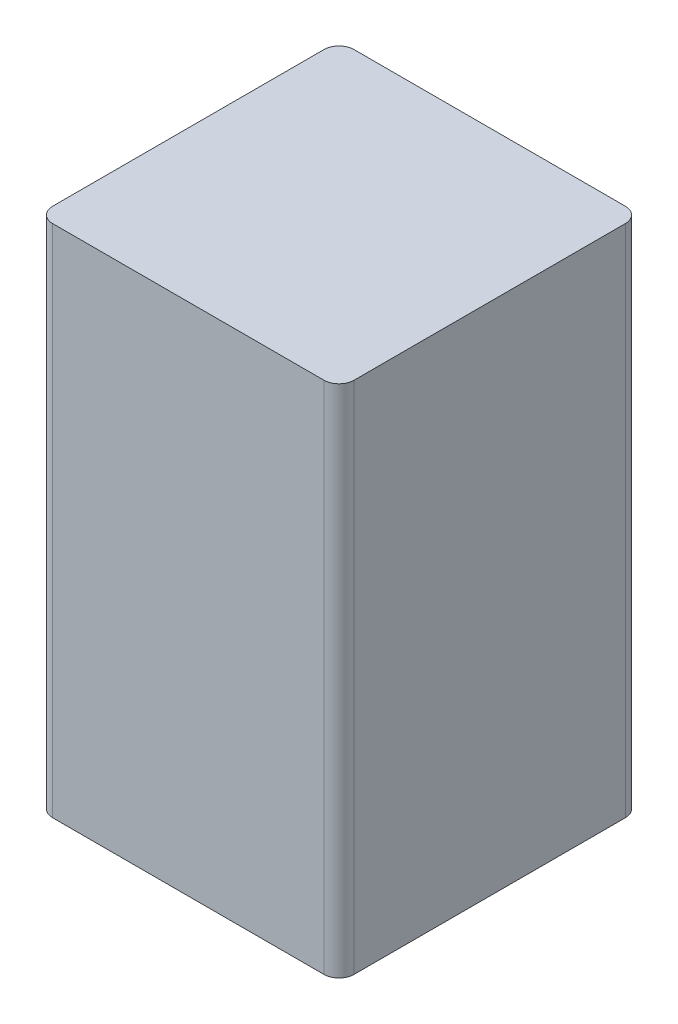
ISO-10303-21;
HEADER;
FILE_DESCRIPTION(('STEP AP214'),'2;1');
FILE_NAME('part.step','',(''),(''),'','','');
FILE_SCHEMA(('AUTOMOTIVE_DESIGN { 1 0 10303 214 1 1 1 1 }'));
ENDSEC;
DATA;
#1=APPLICATION_CONTEXT('core data for automotive mechanical design processes');
#2=APPLICATION_PROTOCOL_DEFINITION('international standard','automotive_design',2000,#1);
#3=PRODUCT_CONTEXT('',#1,'mechanical');
#4=PRODUCT('Part','Part','',(#3));
#5=PRODUCT_RELATED_PRODUCT_CATEGORY('part','',(#4));
#6=PRODUCT_DEFINITION_FORMATION('','',#4);
#7=PRODUCT_DEFINITION_CONTEXT('part definition',#1,'design');
#8=PRODUCT_DEFINITION('design','',#6,#7);
#9=PRODUCT_DEFINITION_SHAPE('','',#8);
#10=(LENGTH_UNIT() NAMED_UNIT(*) SI_UNIT(.MILLI.,.METRE.));
#11=(NAMED_UNIT(*) PLANE_ANGLE_UNIT() SI_UNIT($,.RADIAN.));
#12=(NAMED_UNIT(*) SI_UNIT($,.STERADIAN.) SOLID_ANGLE_UNIT());
#13=UNCERTAINTY_MEASURE_WITH_UNIT(LENGTH_MEASURE(1.E-05),#10,'distance_accuracy_value','');
#14=(GEOMETRIC_REPRESENTATION_CONTEXT(3) GLOBAL_UNCERTAINTY_ASSIGNED_CONTEXT((#13)) GLOBAL_UNIT_ASSIGNED_CONTEXT((#10,
#11,#12)) REPRESENTATION_CONTEXT('',''));
#15=CARTESIAN_POINT('',(0.,0.,0.));
#16=DIRECTION('',(0.,0.,1.));
#17=DIRECTION('',(1.,0.,0.));
#18=AXIS2_PLACEMENT_3D('',#15,#16,#17);
#19=CARTESIAN_POINT('',(0.,68.3,40.));
#20=DIRECTION('',(1.,0.,0.));
#21=DIRECTION('',(0.,0.,-1.));
#22=AXIS2_PLACEMENT_3D('',#19,#20,#21);
#23=PLANE('',#22);
#24=DIRECTION('',(0.,0.,-1.));
#25=VECTOR('',#24,1.);
#26=CARTESIAN_POINT('',(0.,68.3,40.));
#27=LINE('',#26,#25);
#28=CARTESIAN_POINT('',(0.,68.3,38.));
#29=VERTEX_POINT('',#28);
#30=CARTESIAN_POINT('',(0.,68.3,2.));
#31=VERTEX_POINT('',#30);
#32=EDGE_CURVE('E160',#29,#31,#27,.T.);
#33=ORIENTED_EDGE('',*,*,#32,.T.);
#34=DIRECTION('',(0.,-1.,0.));
#35=VECTOR('',#34,1.);
#36=CARTESIAN_POINT('',(0.,68.3,2.));
#37=LINE('',#36,#35);
#38=CARTESIAN_POINT('',(0.,0.,2.));
#39=VERTEX_POINT('',#38);
#40=EDGE_CURVE('E124',#31,#39,#37,.T.);
#41=ORIENTED_EDGE('',*,*,#40,.T.);
#42=DIRECTION('',(0.,0.,-1.));
#43=VECTOR('',#42,1.);
#44=CARTESIAN_POINT('',(0.,0.,40.));
#45=LINE('',#44,#43);
#46=CARTESIAN_POINT('',(0.,0.,38.));
#47=VERTEX_POINT('',#46);
#48=EDGE_CURVE('E109',#47,#39,#45,.T.);
#49=ORIENTED_EDGE('',*,*,#48,.F.);
#50=DIRECTION('',(0.,-1.,0.));
#51=VECTOR('',#50,1.);
#52=CARTESIAN_POINT('',(0.,68.3,38.));
#53=LINE('',#52,#51);
#54=EDGE_CURVE('E121',#47,#29,#53,.F.);
#55=ORIENTED_EDGE('',*,*,#54,.T.);
#56=EDGE_LOOP('',(#33,#41,#49,#55));
#57=FACE_BOUND('',#56,.T.);
#58=ADVANCED_FACE('F39',(#57),#23,.F.);
#59=CARTESIAN_POINT('',(0.,0.,40.));
#60=DIRECTION('',(0.,1.,0.));
#61=DIRECTION('',(0.,0.,1.));
#62=AXIS2_PLACEMENT_3D('',#59,#60,#61);
#63=PLANE('',#62);
#64=ORIENTED_EDGE('',*,*,#48,.T.);
#65=CARTESIAN_POINT('',(2.,0.,2.));
#66=DIRECTION('',(0.,1.,0.));
#67=DIRECTION('',(0.,0.,1.));
#68=AXIS2_PLACEMENT_3D('',#65,#66,#67);
#69=CIRCLE('',#68,2.);
#70=CARTESIAN_POINT('',(2.,0.,0.));
#71=VERTEX_POINT('',#70);
#72=EDGE_CURVE('E136',#39,#71,#69,.F.);
#73=ORIENTED_EDGE('',*,*,#72,.T.);
#74=DIRECTION('',(1.,0.,0.));
#75=VECTOR('',#74,1.);
#76=CARTESIAN_POINT('',(0.,0.,0.));
#77=LINE('',#76,#75);
#78=CARTESIAN_POINT('',(38.,0.,0.));
#79=VERTEX_POINT('',#78);
#80=EDGE_CURVE('E167',#71,#79,#77,.T.);
#81=ORIENTED_EDGE('',*,*,#80,.T.);
#82=CARTESIAN_POINT('',(38.,0.,2.));
#83=DIRECTION('',(0.,1.,0.));
#84=DIRECTION('',(0.,0.,1.));
#85=AXIS2_PLACEMENT_3D('',#82,#83,#84);
#86=CIRCLE('',#85,2.);
#87=CARTESIAN_POINT('',(40.,0.,2.));
#88=VERTEX_POINT('',#87);
#89=EDGE_CURVE('E115',#79,#88,#86,.F.);
#90=ORIENTED_EDGE('',*,*,#89,.T.);
#91=DIRECTION('',(0.,0.,-1.));
#92=VECTOR('',#91,1.);
#93=CARTESIAN_POINT('',(40.,0.,40.));
#94=LINE('',#93,#92);
#95=CARTESIAN_POINT('',(40.,0.,38.));
#96=VERTEX_POINT('',#95);
#97=EDGE_CURVE('E125',#96,#88,#94,.T.);
#98=ORIENTED_EDGE('',*,*,#97,.F.);
#99=CARTESIAN_POINT('',(38.,0.,38.));
#100=DIRECTION('',(0.,1.,0.));
#101=DIRECTION('',(0.,0.,1.));
#102=AXIS2_PLACEMENT_3D('',#99,#100,#101);
#103=CIRCLE('',#102,2.);
#104=CARTESIAN_POINT('',(38.,0.,40.));
#105=VERTEX_POINT('',#104);
#106=EDGE_CURVE('E116',#96,#105,#103,.F.);
#107=ORIENTED_EDGE('',*,*,#106,.T.);
#108=DIRECTION('',(1.,0.,0.));
#109=VECTOR('',#108,1.);
#110=CARTESIAN_POINT('',(0.,0.,40.));
#111=LINE('',#110,#109);
#112=CARTESIAN_POINT('',(2.,0.,40.));
#113=VERTEX_POINT('',#112);
#114=EDGE_CURVE('E111',#113,#105,#111,.T.);
#115=ORIENTED_EDGE('',*,*,#114,.F.);
#116=CARTESIAN_POINT('',(2.,0.,38.));
#117=DIRECTION('',(0.,1.,0.));
#118=DIRECTION('',(0.,0.,1.));
#119=AXIS2_PLACEMENT_3D('',#116,#117,#118);
#120=CIRCLE('',#119,2.);
#121=EDGE_CURVE('E106',#113,#47,#120,.F.);
#122=ORIENTED_EDGE('',*,*,#121,.T.);
#123=EDGE_LOOP('',(#64,#73,#81,#90,#98,#107,#115,#122));
#124=FACE_BOUND('',#123,.T.);
#125=ADVANCED_FACE('F108',(#124),#63,.F.);
#126=CARTESIAN_POINT('',(40.,0.,40.));
#127=DIRECTION('',(-1.,0.,0.));
#128=DIRECTION('',(0.,0.,1.));
#129=AXIS2_PLACEMENT_3D('',#126,#127,#128);
#130=PLANE('',#129);
#131=ORIENTED_EDGE('',*,*,#97,.T.);
#132=DIRECTION('',(0.,1.,0.));
#133=VECTOR('',#132,1.);
#134=CARTESIAN_POINT('',(40.,0.,2.));
#135=LINE('',#134,#133);
#136=CARTESIAN_POINT('',(40.,68.3,2.));
#137=VERTEX_POINT('',#136);
#138=EDGE_CURVE('E149',#88,#137,#135,.T.);
#139=ORIENTED_EDGE('',*,*,#138,.T.);
#140=DIRECTION('',(0.,0.,-1.));
#141=VECTOR('',#140,1.);
#142=CARTESIAN_POINT('',(40.,68.3,40.));
#143=LINE('',#142,#141);
#144=CARTESIAN_POINT('',(40.,68.3,38.));
#145=VERTEX_POINT('',#144);
#146=EDGE_CURVE('E162',#145,#137,#143,.T.);
#147=ORIENTED_EDGE('',*,*,#146,.F.);
#148=DIRECTION('',(0.,1.,0.));
#149=VECTOR('',#148,1.);
#150=CARTESIAN_POINT('',(40.,0.,38.));
#151=LINE('',#150,#149);
#152=EDGE_CURVE('E147',#145,#96,#151,.F.);
#153=ORIENTED_EDGE('',*,*,#152,.T.);
#154=EDGE_LOOP('',(#131,#139,#147,#153));
#155=FACE_BOUND('',#154,.T.);
#156=ADVANCED_FACE('F174',(#155),#130,.F.);
#157=CARTESIAN_POINT('',(40.,68.3,40.));
#158=DIRECTION('',(0.,-1.,0.));
#159=DIRECTION('',(0.,0.,-1.));
#160=AXIS2_PLACEMENT_3D('',#157,#158,#159);
#161=PLANE('',#160);
#162=DIRECTION('',(-1.,0.,0.));
#163=VECTOR('',#162,1.);
#164=CARTESIAN_POINT('',(40.,68.3,0.));
#165=LINE('',#164,#163);
#166=CARTESIAN_POINT('',(38.,68.3,0.));
#167=VERTEX_POINT('',#166);
#168=CARTESIAN_POINT('',(2.,68.3,0.));
#169=VERTEX_POINT('',#168);
#170=EDGE_CURVE('E164',#167,#169,#165,.T.);
#171=ORIENTED_EDGE('',*,*,#170,.T.);
#172=CARTESIAN_POINT('',(2.,68.3,2.));
#173=DIRECTION('',(0.,-1.,0.));
#174=DIRECTION('',(0.,0.,-1.));
#175=AXIS2_PLACEMENT_3D('',#172,#173,#174);
#176=CIRCLE('',#175,2.);
#177=EDGE_CURVE('E145',#169,#31,#176,.F.);
#178=ORIENTED_EDGE('',*,*,#177,.T.);
#179=ORIENTED_EDGE('',*,*,#32,.F.);
#180=CARTESIAN_POINT('',(2.,68.3,38.));
#181=DIRECTION('',(0.,-1.,0.));
#182=DIRECTION('',(0.,0.,-1.));
#183=AXIS2_PLACEMENT_3D('',#180,#181,#182);
#184=CIRCLE('',#183,2.);
#185=CARTESIAN_POINT('',(2.,68.3,40.));
#186=VERTEX_POINT('',#185);
#187=EDGE_CURVE('E129',#29,#186,#184,.F.);
#188=ORIENTED_EDGE('',*,*,#187,.T.);
#189=DIRECTION('',(-1.,0.,0.));
#190=VECTOR('',#189,1.);
#191=CARTESIAN_POINT('',(40.,68.3,40.));
#192=LINE('',#191,#190);
#193=CARTESIAN_POINT('',(38.,68.3,40.));
#194=VERTEX_POINT('',#193);
#195=EDGE_CURVE('E155',#194,#186,#192,.T.);
#196=ORIENTED_EDGE('',*,*,#195,.F.);
#197=CARTESIAN_POINT('',(38.,68.3,38.));
#198=DIRECTION('',(0.,-1.,0.));
#199=DIRECTION('',(0.,0.,-1.));
#200=AXIS2_PLACEMENT_3D('',#197,#198,#199);
#201=CIRCLE('',#200,2.);
#202=EDGE_CURVE('E62',#194,#145,#201,.F.);
#203=ORIENTED_EDGE('',*,*,#202,.T.);
#204=ORIENTED_EDGE('',*,*,#146,.T.);
#205=CARTESIAN_POINT('',(38.,68.3,2.));
#206=DIRECTION('',(0.,-1.,0.));
#207=DIRECTION('',(0.,0.,-1.));
#208=AXIS2_PLACEMENT_3D('',#205,#206,#207);
#209=CIRCLE('',#208,2.);
#210=EDGE_CURVE('E54',#137,#167,#209,.F.);
#211=ORIENTED_EDGE('',*,*,#210,.T.);
#212=EDGE_LOOP('',(#171,#178,#179,#188,#196,#203,#204,#211));
#213=FACE_BOUND('',#212,.T.);
#214=ADVANCED_FACE('F159',(#213),#161,.F.);
#215=CARTESIAN_POINT('',(0.,0.,40.));
#216=DIRECTION('',(0.,0.,1.));
#217=DIRECTION('',(1.,0.,0.));
#218=AXIS2_PLACEMENT_3D('',#215,#216,#217);
#219=PLANE('',#218);
#220=ORIENTED_EDGE('',*,*,#195,.T.);
#221=DIRECTION('',(0.,-1.,0.));
#222=VECTOR('',#221,1.);
#223=CARTESIAN_POINT('',(2.,0.,40.));
#224=LINE('',#223,#222);
#225=EDGE_CURVE('E11',#186,#113,#224,.T.);
#226=ORIENTED_EDGE('',*,*,#225,.T.);
#227=ORIENTED_EDGE('',*,*,#114,.T.);
#228=DIRECTION('',(0.,1.,0.));
#229=VECTOR('',#228,1.);
#230=CARTESIAN_POINT('',(38.,68.3,40.));
#231=LINE('',#230,#229);
#232=EDGE_CURVE('E47',#105,#194,#231,.T.);
#233=ORIENTED_EDGE('',*,*,#232,.T.);
#234=EDGE_LOOP('',(#220,#226,#227,#233));
#235=FACE_BOUND('',#234,.T.);
#236=ADVANCED_FACE('F154',(#235),#219,.T.);
#237=CARTESIAN_POINT('',(0.,0.,0.));
#238=DIRECTION('',(0.,0.,1.));
#239=DIRECTION('',(1.,0.,0.));
#240=AXIS2_PLACEMENT_3D('',#237,#238,#239);
#241=PLANE('',#240);
#242=ORIENTED_EDGE('',*,*,#80,.F.);
#243=DIRECTION('',(0.,-1.,0.));
#244=VECTOR('',#243,1.);
#245=CARTESIAN_POINT('',(2.,0.,0.));
#246=LINE('',#245,#244);
#247=EDGE_CURVE('E140',#71,#169,#246,.F.);
#248=ORIENTED_EDGE('',*,*,#247,.T.);
#249=ORIENTED_EDGE('',*,*,#170,.F.);
#250=DIRECTION('',(0.,1.,0.));
#251=VECTOR('',#250,1.);
#252=CARTESIAN_POINT('',(38.,0.,0.));
#253=LINE('',#252,#251);
#254=EDGE_CURVE('E138',#167,#79,#253,.F.);
#255=ORIENTED_EDGE('',*,*,#254,.T.);
#256=EDGE_LOOP('',(#242,#248,#249,#255));
#257=FACE_BOUND('',#256,.T.);
#258=ADVANCED_FACE('F181',(#257),#241,.F.);
#259=CARTESIAN_POINT('',(2.,68.3,2.));
#260=DIRECTION('',(0.,-1.,0.));
#261=DIRECTION('',(0.,0.,-1.));
#262=AXIS2_PLACEMENT_3D('',#259,#260,#261);
#263=CYLINDRICAL_SURFACE('',#262,2.);
#264=ORIENTED_EDGE('',*,*,#177,.F.);
#265=ORIENTED_EDGE('',*,*,#247,.F.);
#266=ORIENTED_EDGE('',*,*,#72,.F.);
#267=ORIENTED_EDGE('',*,*,#40,.F.);
#268=EDGE_LOOP('',(#264,#265,#266,#267));
#269=FACE_BOUND('',#268,.T.);
#270=ADVANCED_FACE('F185',(#269),#263,.T.);
#271=CARTESIAN_POINT('',(38.,0.,2.));
#272=DIRECTION('',(0.,1.,0.));
#273=DIRECTION('',(0.,0.,1.));
#274=AXIS2_PLACEMENT_3D('',#271,#272,#273);
#275=CYLINDRICAL_SURFACE('',#274,2.);
#276=ORIENTED_EDGE('',*,*,#89,.F.);
#277=ORIENTED_EDGE('',*,*,#254,.F.);
#278=ORIENTED_EDGE('',*,*,#210,.F.);
#279=ORIENTED_EDGE('',*,*,#138,.F.);
#280=EDGE_LOOP('',(#276,#277,#278,#279));
#281=FACE_BOUND('',#280,.T.);
#282=ADVANCED_FACE('F177',(#281),#275,.T.);
#283=CARTESIAN_POINT('',(2.,0.,38.));
#284=DIRECTION('',(0.,1.,0.));
#285=DIRECTION('',(0.,0.,1.));
#286=AXIS2_PLACEMENT_3D('',#283,#284,#285);
#287=CYLINDRICAL_SURFACE('',#286,2.);
#288=ORIENTED_EDGE('',*,*,#187,.F.);
#289=ORIENTED_EDGE('',*,*,#54,.F.);
#290=ORIENTED_EDGE('',*,*,#121,.F.);
#291=ORIENTED_EDGE('',*,*,#225,.F.);
#292=EDGE_LOOP('',(#288,#289,#290,#291));
#293=FACE_BOUND('',#292,.T.);
#294=ADVANCED_FACE('F128',(#293),#287,.T.);
#295=CARTESIAN_POINT('',(38.,0.,38.));
#296=DIRECTION('',(0.,-1.,0.));
#297=DIRECTION('',(0.,0.,-1.));
#298=AXIS2_PLACEMENT_3D('',#295,#296,#297);
#299=CYLINDRICAL_SURFACE('',#298,2.);
#300=ORIENTED_EDGE('',*,*,#106,.F.);
#301=ORIENTED_EDGE('',*,*,#152,.F.);
#302=ORIENTED_EDGE('',*,*,#202,.F.);
#303=ORIENTED_EDGE('',*,*,#232,.F.);
#304=EDGE_LOOP('',(#300,#301,#302,#303));
#305=FACE_BOUND('',#304,.T.);
#306=ADVANCED_FACE('F41',(#305),#299,.T.);
#307=CLOSED_SHELL('',(#58,#125,#156,#214,#236,#258,#270,#282,#294,#306));
#308=MANIFOLD_SOLID_BREP('B2',#307);
#309=ADVANCED_BREP_SHAPE_REPRESENTATION('',(#18,#308),#14);
#310=SHAPE_DEFINITION_REPRESENTATION(#9,#309);
ENDSEC;
END-ISO-10303-21;
